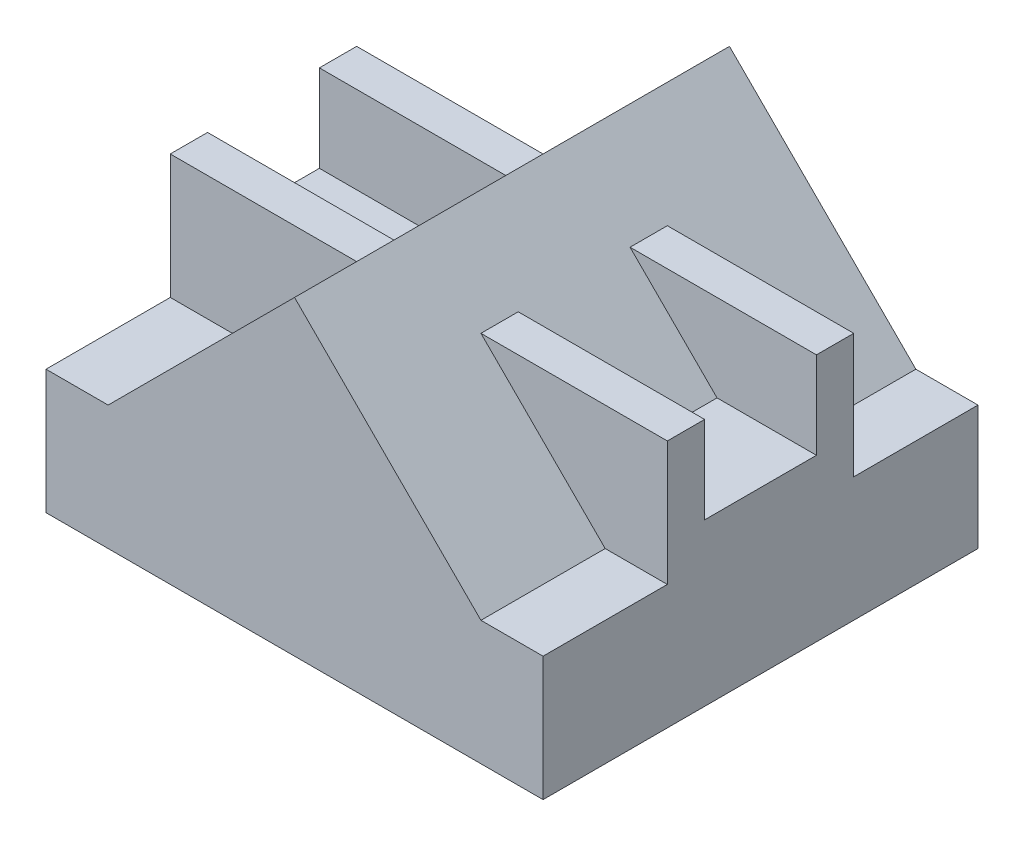
ISO-10303-21;
HEADER;
FILE_DESCRIPTION(('STEP AP214'),'2;1');
FILE_NAME('part.step','',(''),(''),'','','');
FILE_SCHEMA(('AUTOMOTIVE_DESIGN { 1 0 10303 214 1 1 1 1 }'));
ENDSEC;
DATA;
#1=APPLICATION_CONTEXT('core data for automotive mechanical design processes');
#2=APPLICATION_PROTOCOL_DEFINITION('international standard','automotive_design',2000,#1);
#3=PRODUCT_CONTEXT('',#1,'mechanical');
#4=PRODUCT('Part','Part','',(#3));
#5=PRODUCT_RELATED_PRODUCT_CATEGORY('part','',(#4));
#6=PRODUCT_DEFINITION_FORMATION('','',#4);
#7=PRODUCT_DEFINITION_CONTEXT('part definition',#1,'design');
#8=PRODUCT_DEFINITION('design','',#6,#7);
#9=PRODUCT_DEFINITION_SHAPE('','',#8);
#10=(LENGTH_UNIT() NAMED_UNIT(*) SI_UNIT(.MILLI.,.METRE.));
#11=(NAMED_UNIT(*) PLANE_ANGLE_UNIT() SI_UNIT($,.RADIAN.));
#12=(NAMED_UNIT(*) SI_UNIT($,.STERADIAN.) SOLID_ANGLE_UNIT());
#13=UNCERTAINTY_MEASURE_WITH_UNIT(LENGTH_MEASURE(1.E-05),#10,'distance_accuracy_value','');
#14=(GEOMETRIC_REPRESENTATION_CONTEXT(3) GLOBAL_UNCERTAINTY_ASSIGNED_CONTEXT((#13)) GLOBAL_UNIT_ASSIGNED_CONTEXT((#10,
#11,#12)) REPRESENTATION_CONTEXT('',''));
#15=CARTESIAN_POINT('',(0.,0.,0.));
#16=DIRECTION('',(0.,0.,1.));
#17=DIRECTION('',(1.,0.,0.));
#18=AXIS2_PLACEMENT_3D('',#15,#16,#17);
#19=CARTESIAN_POINT('',(0.,50.,-175.));
#20=DIRECTION('',(0.,1.,0.));
#21=DIRECTION('',(0.,0.,1.));
#22=AXIS2_PLACEMENT_3D('',#19,#20,#21);
#23=PLANE('',#22);
#24=DIRECTION('',(0.,0.,1.));
#25=VECTOR('',#24,1.);
#26=CARTESIAN_POINT('',(74.9999999999992,50.,-175.));
#27=LINE('',#26,#25);
#28=CARTESIAN_POINT('',(74.9999999999992,50.,-175.));
#29=VERTEX_POINT('',#28);
#30=CARTESIAN_POINT('',(74.9999999999992,50.,-125.));
#31=VERTEX_POINT('',#30);
#32=EDGE_CURVE('E339',#29,#31,#27,.T.);
#33=ORIENTED_EDGE('',*,*,#32,.T.);
#34=DIRECTION('',(1.,0.,0.));
#35=VECTOR('',#34,1.);
#36=CARTESIAN_POINT('',(-100.,50.,-125.));
#37=LINE('',#36,#35);
#38=CARTESIAN_POINT('',(100.,50.,-125.));
#39=VERTEX_POINT('',#38);
#40=EDGE_CURVE('E241',#31,#39,#37,.T.);
#41=ORIENTED_EDGE('',*,*,#40,.T.);
#42=DIRECTION('',(0.,0.,1.));
#43=VECTOR('',#42,1.);
#44=CARTESIAN_POINT('',(100.,50.,-175.));
#45=LINE('',#44,#43);
#46=CARTESIAN_POINT('',(100.,50.,-175.));
#47=VERTEX_POINT('',#46);
#48=EDGE_CURVE('E342',#47,#39,#45,.T.);
#49=ORIENTED_EDGE('',*,*,#48,.F.);
#50=DIRECTION('',(-1.,0.,0.));
#51=VECTOR('',#50,1.);
#52=CARTESIAN_POINT('',(0.,50.,-175.));
#53=LINE('',#52,#51);
#54=EDGE_CURVE('E318',#47,#29,#53,.T.);
#55=ORIENTED_EDGE('',*,*,#54,.T.);
#56=EDGE_LOOP('',(#33,#41,#49,#55));
#57=FACE_BOUND('',#56,.T.);
#58=ADVANCED_FACE('F41',(#57),#23,.T.);
#59=CARTESIAN_POINT('',(0.,49.9999999999999,-175.));
#60=DIRECTION('',(0.,-1.,0.));
#61=DIRECTION('',(1.,0.,0.));
#62=AXIS2_PLACEMENT_3D('',#59,#60,#61);
#63=PLANE('',#62);
#64=DIRECTION('',(1.,0.,0.));
#65=VECTOR('',#64,1.);
#66=CARTESIAN_POINT('',(-100.,50.,-50.));
#67=LINE('',#66,#65);
#68=CARTESIAN_POINT('',(-100.,50.,-50.));
#69=VERTEX_POINT('',#68);
#70=CARTESIAN_POINT('',(-74.9999999999992,50.,-50.));
#71=VERTEX_POINT('',#70);
#72=EDGE_CURVE('E62',#69,#71,#67,.T.);
#73=ORIENTED_EDGE('',*,*,#72,.F.);
#74=DIRECTION('',(0.,0.,1.));
#75=VECTOR('',#74,1.);
#76=CARTESIAN_POINT('',(-100.,50.,-175.));
#77=LINE('',#76,#75);
#78=CARTESIAN_POINT('',(-100.,50.,0.));
#79=VERTEX_POINT('',#78);
#80=EDGE_CURVE('E352',#69,#79,#77,.T.);
#81=ORIENTED_EDGE('',*,*,#80,.T.);
#82=DIRECTION('',(1.,0.,0.));
#83=VECTOR('',#82,1.);
#84=CARTESIAN_POINT('',(0.,49.9999999999999,0.));
#85=LINE('',#84,#83);
#86=CARTESIAN_POINT('',(-74.9999999999992,50.,0.));
#87=VERTEX_POINT('',#86);
#88=EDGE_CURVE('E330',#79,#87,#85,.T.);
#89=ORIENTED_EDGE('',*,*,#88,.T.);
#90=DIRECTION('',(0.,0.,1.));
#91=VECTOR('',#90,1.);
#92=CARTESIAN_POINT('',(-74.9999999999992,50.,-175.));
#93=LINE('',#92,#91);
#94=EDGE_CURVE('E358',#71,#87,#93,.T.);
#95=ORIENTED_EDGE('',*,*,#94,.F.);
#96=EDGE_LOOP('',(#73,#81,#89,#95));
#97=FACE_BOUND('',#96,.T.);
#98=ADVANCED_FACE('F414',(#97),#63,.F.);
#99=CARTESIAN_POINT('',(62.5,62.4999999999993,-175.));
#100=DIRECTION('',(-0.707106781186551,-0.707106781186544,0.));
#101=DIRECTION('',(0.707106781186544,-0.707106781186551,0.));
#102=AXIS2_PLACEMENT_3D('',#99,#100,#101);
#103=PLANE('',#102);
#104=CARTESIAN_POINT('',(74.9999999999991,50.,-50.));
#105=VERTEX_POINT('',#104);
#106=CARTESIAN_POINT('',(74.9999999999992,50.,0.));
#107=VERTEX_POINT('',#106);
#108=EDGE_CURVE('E341',#105,#107,#27,.T.);
#109=ORIENTED_EDGE('',*,*,#108,.F.);
#110=DIRECTION('',(-0.707106781186544,0.707106781186551,0.));
#111=VECTOR('',#110,1.);
#112=CARTESIAN_POINT('',(62.5,62.4999999999993,-50.));
#113=LINE('',#112,#111);
#114=CARTESIAN_POINT('',(24.9999999999997,100.,-50.));
#115=VERTEX_POINT('',#114);
#116=EDGE_CURVE('E297',#105,#115,#113,.T.);
#117=ORIENTED_EDGE('',*,*,#116,.T.);
#118=DIRECTION('',(0.,0.,-1.));
#119=VECTOR('',#118,1.);
#120=CARTESIAN_POINT('',(24.9999999999997,100.,-175.));
#121=LINE('',#120,#119);
#122=CARTESIAN_POINT('',(24.9999999999997,100.,-65.));
#123=VERTEX_POINT('',#122);
#124=EDGE_CURVE('E298',#115,#123,#121,.T.);
#125=ORIENTED_EDGE('',*,*,#124,.T.);
#126=DIRECTION('',(0.707106781186544,-0.707106781186551,0.));
#127=VECTOR('',#126,1.);
#128=CARTESIAN_POINT('',(62.5,62.4999999999993,-65.));
#129=LINE('',#128,#127);
#130=CARTESIAN_POINT('',(59.9999999999993,65.,-65.));
#131=VERTEX_POINT('',#130);
#132=EDGE_CURVE('E291',#123,#131,#129,.T.);
#133=ORIENTED_EDGE('',*,*,#132,.T.);
#134=DIRECTION('',(0.,0.,-1.));
#135=VECTOR('',#134,1.);
#136=CARTESIAN_POINT('',(59.9999999999993,65.,-175.));
#137=LINE('',#136,#135);
#138=CARTESIAN_POINT('',(59.9999999999993,65.,-110.));
#139=VERTEX_POINT('',#138);
#140=EDGE_CURVE('E289',#131,#139,#137,.T.);
#141=ORIENTED_EDGE('',*,*,#140,.T.);
#142=DIRECTION('',(-0.707106781186544,0.707106781186551,0.));
#143=VECTOR('',#142,1.);
#144=CARTESIAN_POINT('',(62.5,62.4999999999993,-110.));
#145=LINE('',#144,#143);
#146=CARTESIAN_POINT('',(24.9999999999997,100.,-110.));
#147=VERTEX_POINT('',#146);
#148=EDGE_CURVE('E290',#139,#147,#145,.T.);
#149=ORIENTED_EDGE('',*,*,#148,.T.);
#150=DIRECTION('',(0.,0.,-1.));
#151=VECTOR('',#150,1.);
#152=CARTESIAN_POINT('',(24.9999999999997,100.,-175.));
#153=LINE('',#152,#151);
#154=CARTESIAN_POINT('',(24.9999999999997,100.,-125.));
#155=VERTEX_POINT('',#154);
#156=EDGE_CURVE('E281',#147,#155,#153,.T.);
#157=ORIENTED_EDGE('',*,*,#156,.T.);
#158=DIRECTION('',(0.707106781186544,-0.707106781186551,0.));
#159=VECTOR('',#158,1.);
#160=CARTESIAN_POINT('',(62.5,62.4999999999993,-125.));
#161=LINE('',#160,#159);
#162=EDGE_CURVE('E263',#155,#31,#161,.T.);
#163=ORIENTED_EDGE('',*,*,#162,.T.);
#164=ORIENTED_EDGE('',*,*,#32,.F.);
#165=DIRECTION('',(0.707106781186544,-0.707106781186551,0.));
#166=VECTOR('',#165,1.);
#167=CARTESIAN_POINT('',(62.5,62.4999999999993,-175.));
#168=LINE('',#167,#166);
#169=CARTESIAN_POINT('',(0.,125.,-175.));
#170=VERTEX_POINT('',#169);
#171=EDGE_CURVE('E301',#170,#29,#168,.T.);
#172=ORIENTED_EDGE('',*,*,#171,.F.);
#173=DIRECTION('',(0.,0.,1.));
#174=VECTOR('',#173,1.);
#175=CARTESIAN_POINT('',(0.,125.,-175.));
#176=LINE('',#175,#174);
#177=CARTESIAN_POINT('',(0.,125.,0.));
#178=VERTEX_POINT('',#177);
#179=EDGE_CURVE('E321',#170,#178,#176,.T.);
#180=ORIENTED_EDGE('',*,*,#179,.T.);
#181=DIRECTION('',(0.707106781186544,-0.707106781186551,0.));
#182=VECTOR('',#181,1.);
#183=CARTESIAN_POINT('',(62.5,62.4999999999993,0.));
#184=LINE('',#183,#182);
#185=EDGE_CURVE('E302',#178,#107,#184,.T.);
#186=ORIENTED_EDGE('',*,*,#185,.T.);
#187=EDGE_LOOP('',(#109,#117,#125,#133,#141,#149,#157,#163,#164,#172,#180,#186));
#188=FACE_BOUND('',#187,.T.);
#189=ADVANCED_FACE('F43',(#188),#103,.F.);
#190=CARTESIAN_POINT('',(100.,50.,-50.));
#191=VERTEX_POINT('',#190);
#192=EDGE_CURVE('E265',#105,#191,#67,.T.);
#193=ORIENTED_EDGE('',*,*,#192,.F.);
#194=ORIENTED_EDGE('',*,*,#108,.T.);
#195=DIRECTION('',(-1.,0.,0.));
#196=VECTOR('',#195,1.);
#197=CARTESIAN_POINT('',(0.,50.,0.));
#198=LINE('',#197,#196);
#199=CARTESIAN_POINT('',(100.,50.,0.));
#200=VERTEX_POINT('',#199);
#201=EDGE_CURVE('E308',#200,#107,#198,.T.);
#202=ORIENTED_EDGE('',*,*,#201,.F.);
#203=EDGE_CURVE('E347',#191,#200,#45,.T.);
#204=ORIENTED_EDGE('',*,*,#203,.F.);
#205=EDGE_LOOP('',(#193,#194,#202,#204));
#206=FACE_BOUND('',#205,.T.);
#207=ADVANCED_FACE('F407',(#206),#23,.T.);
#208=CARTESIAN_POINT('',(100.,0.,-175.));
#209=DIRECTION('',(1.,0.,0.));
#210=DIRECTION('',(0.,0.,-1.));
#211=AXIS2_PLACEMENT_3D('',#208,#209,#210);
#212=PLANE('',#211);
#213=DIRECTION('',(0.,1.,0.));
#214=VECTOR('',#213,1.);
#215=CARTESIAN_POINT('',(100.,0.,0.));
#216=LINE('',#215,#214);
#217=CARTESIAN_POINT('',(100.,0.,0.));
#218=VERTEX_POINT('',#217);
#219=EDGE_CURVE('E332',#218,#200,#216,.T.);
#220=ORIENTED_EDGE('',*,*,#219,.F.);
#221=DIRECTION('',(0.,0.,1.));
#222=VECTOR('',#221,1.);
#223=CARTESIAN_POINT('',(100.,0.,-175.));
#224=LINE('',#223,#222);
#225=CARTESIAN_POINT('',(100.,0.,-175.));
#226=VERTEX_POINT('',#225);
#227=EDGE_CURVE('E346',#226,#218,#224,.T.);
#228=ORIENTED_EDGE('',*,*,#227,.F.);
#229=DIRECTION('',(0.,1.,0.));
#230=VECTOR('',#229,1.);
#231=CARTESIAN_POINT('',(100.,0.,-175.));
#232=LINE('',#231,#230);
#233=EDGE_CURVE('E314',#226,#47,#232,.T.);
#234=ORIENTED_EDGE('',*,*,#233,.T.);
#235=ORIENTED_EDGE('',*,*,#48,.T.);
#236=DIRECTION('',(0.,1.,0.));
#237=VECTOR('',#236,1.);
#238=CARTESIAN_POINT('',(100.,50.,-125.));
#239=LINE('',#238,#237);
#240=CARTESIAN_POINT('',(100.,100.,-125.));
#241=VERTEX_POINT('',#240);
#242=EDGE_CURVE('E242',#39,#241,#239,.T.);
#243=ORIENTED_EDGE('',*,*,#242,.T.);
#244=DIRECTION('',(0.,0.,1.));
#245=VECTOR('',#244,1.);
#246=CARTESIAN_POINT('',(100.,100.,-125.));
#247=LINE('',#246,#245);
#248=CARTESIAN_POINT('',(100.,100.,-110.));
#249=VERTEX_POINT('',#248);
#250=EDGE_CURVE('E250',#241,#249,#247,.T.);
#251=ORIENTED_EDGE('',*,*,#250,.T.);
#252=DIRECTION('',(0.,-1.,0.));
#253=VECTOR('',#252,1.);
#254=CARTESIAN_POINT('',(100.,100.,-110.));
#255=LINE('',#254,#253);
#256=CARTESIAN_POINT('',(100.,65.,-110.));
#257=VERTEX_POINT('',#256);
#258=EDGE_CURVE('E248',#249,#257,#255,.T.);
#259=ORIENTED_EDGE('',*,*,#258,.T.);
#260=DIRECTION('',(0.,0.,1.));
#261=VECTOR('',#260,1.);
#262=CARTESIAN_POINT('',(100.,65.,-65.));
#263=LINE('',#262,#261);
#264=CARTESIAN_POINT('',(100.,65.,-65.));
#265=VERTEX_POINT('',#264);
#266=EDGE_CURVE('E251',#257,#265,#263,.T.);
#267=ORIENTED_EDGE('',*,*,#266,.T.);
#268=DIRECTION('',(0.,1.,0.));
#269=VECTOR('',#268,1.);
#270=CARTESIAN_POINT('',(100.,100.,-65.));
#271=LINE('',#270,#269);
#272=CARTESIAN_POINT('',(100.,100.,-65.));
#273=VERTEX_POINT('',#272);
#274=EDGE_CURVE('E258',#265,#273,#271,.T.);
#275=ORIENTED_EDGE('',*,*,#274,.T.);
#276=DIRECTION('',(0.,0.,1.));
#277=VECTOR('',#276,1.);
#278=CARTESIAN_POINT('',(100.,100.,-50.));
#279=LINE('',#278,#277);
#280=CARTESIAN_POINT('',(100.,100.,-50.));
#281=VERTEX_POINT('',#280);
#282=EDGE_CURVE('E230',#273,#281,#279,.T.);
#283=ORIENTED_EDGE('',*,*,#282,.T.);
#284=DIRECTION('',(0.,-1.,0.));
#285=VECTOR('',#284,1.);
#286=CARTESIAN_POINT('',(100.,50.,-50.));
#287=LINE('',#286,#285);
#288=EDGE_CURVE('E57',#281,#191,#287,.T.);
#289=ORIENTED_EDGE('',*,*,#288,.T.);
#290=ORIENTED_EDGE('',*,*,#203,.T.);
#291=EDGE_LOOP('',(#220,#228,#234,#235,#243,#251,#259,#267,#275,#283,#289,#290));
#292=FACE_BOUND('',#291,.T.);
#293=ADVANCED_FACE('F404',(#292),#212,.T.);
#294=CARTESIAN_POINT('',(0.,0.,-175.));
#295=DIRECTION('',(0.,1.,0.));
#296=DIRECTION('',(0.,0.,1.));
#297=AXIS2_PLACEMENT_3D('',#294,#295,#296);
#298=PLANE('',#297);
#299=DIRECTION('',(-1.,0.,0.));
#300=VECTOR('',#299,1.);
#301=CARTESIAN_POINT('',(0.,0.,0.));
#302=LINE('',#301,#300);
#303=CARTESIAN_POINT('',(-100.,0.,0.));
#304=VERTEX_POINT('',#303);
#305=EDGE_CURVE('E335',#218,#304,#302,.T.);
#306=ORIENTED_EDGE('',*,*,#305,.T.);
#307=DIRECTION('',(0.,0.,1.));
#308=VECTOR('',#307,1.);
#309=CARTESIAN_POINT('',(-100.,0.,-175.));
#310=LINE('',#309,#308);
#311=CARTESIAN_POINT('',(-100.,0.,-175.));
#312=VERTEX_POINT('',#311);
#313=EDGE_CURVE('E349',#312,#304,#310,.T.);
#314=ORIENTED_EDGE('',*,*,#313,.F.);
#315=DIRECTION('',(-1.,0.,0.));
#316=VECTOR('',#315,1.);
#317=CARTESIAN_POINT('',(0.,0.,-175.));
#318=LINE('',#317,#316);
#319=EDGE_CURVE('E313',#226,#312,#318,.T.);
#320=ORIENTED_EDGE('',*,*,#319,.F.);
#321=ORIENTED_EDGE('',*,*,#227,.T.);
#322=EDGE_LOOP('',(#306,#314,#320,#321));
#323=FACE_BOUND('',#322,.T.);
#324=ADVANCED_FACE('F396',(#323),#298,.F.);
#325=CARTESIAN_POINT('',(-100.,0.,-175.));
#326=DIRECTION('',(1.,0.,0.));
#327=DIRECTION('',(0.,0.,-1.));
#328=AXIS2_PLACEMENT_3D('',#325,#326,#327);
#329=PLANE('',#328);
#330=DIRECTION('',(0.,1.,0.));
#331=VECTOR('',#330,1.);
#332=CARTESIAN_POINT('',(-100.,0.,0.));
#333=LINE('',#332,#331);
#334=EDGE_CURVE('E328',#304,#79,#333,.T.);
#335=ORIENTED_EDGE('',*,*,#334,.T.);
#336=ORIENTED_EDGE('',*,*,#80,.F.);
#337=DIRECTION('',(0.,-1.,0.));
#338=VECTOR('',#337,1.);
#339=CARTESIAN_POINT('',(-100.,50.,-50.));
#340=LINE('',#339,#338);
#341=CARTESIAN_POINT('',(-100.,100.,-50.));
#342=VERTEX_POINT('',#341);
#343=EDGE_CURVE('E238',#342,#69,#340,.T.);
#344=ORIENTED_EDGE('',*,*,#343,.F.);
#345=DIRECTION('',(0.,0.,1.));
#346=VECTOR('',#345,1.);
#347=CARTESIAN_POINT('',(-100.,100.,-50.));
#348=LINE('',#347,#346);
#349=CARTESIAN_POINT('',(-100.,100.,-65.));
#350=VERTEX_POINT('',#349);
#351=EDGE_CURVE('E240',#350,#342,#348,.T.);
#352=ORIENTED_EDGE('',*,*,#351,.F.);
#353=DIRECTION('',(0.,1.,0.));
#354=VECTOR('',#353,1.);
#355=CARTESIAN_POINT('',(-100.,100.,-65.));
#356=LINE('',#355,#354);
#357=CARTESIAN_POINT('',(-100.,65.,-65.));
#358=VERTEX_POINT('',#357);
#359=EDGE_CURVE('E233',#358,#350,#356,.T.);
#360=ORIENTED_EDGE('',*,*,#359,.F.);
#361=DIRECTION('',(0.,0.,1.));
#362=VECTOR('',#361,1.);
#363=CARTESIAN_POINT('',(-100.,65.,-65.));
#364=LINE('',#363,#362);
#365=CARTESIAN_POINT('',(-100.,65.,-110.));
#366=VERTEX_POINT('',#365);
#367=EDGE_CURVE('E231',#366,#358,#364,.T.);
#368=ORIENTED_EDGE('',*,*,#367,.F.);
#369=DIRECTION('',(0.,-1.,0.));
#370=VECTOR('',#369,1.);
#371=CARTESIAN_POINT('',(-100.,100.,-110.));
#372=LINE('',#371,#370);
#373=CARTESIAN_POINT('',(-100.,100.,-110.));
#374=VERTEX_POINT('',#373);
#375=EDGE_CURVE('E217',#374,#366,#372,.T.);
#376=ORIENTED_EDGE('',*,*,#375,.F.);
#377=DIRECTION('',(0.,0.,1.));
#378=VECTOR('',#377,1.);
#379=CARTESIAN_POINT('',(-100.,100.,-125.));
#380=LINE('',#379,#378);
#381=CARTESIAN_POINT('',(-100.,100.,-125.));
#382=VERTEX_POINT('',#381);
#383=EDGE_CURVE('E201',#382,#374,#380,.T.);
#384=ORIENTED_EDGE('',*,*,#383,.F.);
#385=DIRECTION('',(0.,1.,0.));
#386=VECTOR('',#385,1.);
#387=CARTESIAN_POINT('',(-100.,50.,-125.));
#388=LINE('',#387,#386);
#389=CARTESIAN_POINT('',(-100.,50.,-125.));
#390=VERTEX_POINT('',#389);
#391=EDGE_CURVE('E220',#390,#382,#388,.T.);
#392=ORIENTED_EDGE('',*,*,#391,.F.);
#393=CARTESIAN_POINT('',(-100.,50.,-175.));
#394=VERTEX_POINT('',#393);
#395=EDGE_CURVE('E351',#394,#390,#77,.T.);
#396=ORIENTED_EDGE('',*,*,#395,.F.);
#397=DIRECTION('',(0.,1.,0.));
#398=VECTOR('',#397,1.);
#399=CARTESIAN_POINT('',(-100.,0.,-175.));
#400=LINE('',#399,#398);
#401=EDGE_CURVE('E311',#312,#394,#400,.T.);
#402=ORIENTED_EDGE('',*,*,#401,.F.);
#403=ORIENTED_EDGE('',*,*,#313,.T.);
#404=EDGE_LOOP('',(#335,#336,#344,#352,#360,#368,#376,#384,#392,#396,#402,#403));
#405=FACE_BOUND('',#404,.T.);
#406=ADVANCED_FACE('F214',(#405),#329,.F.);
#407=ORIENTED_EDGE('',*,*,#395,.T.);
#408=CARTESIAN_POINT('',(-74.9999999999992,50.,-125.));
#409=VERTEX_POINT('',#408);
#410=EDGE_CURVE('E224',#390,#409,#37,.T.);
#411=ORIENTED_EDGE('',*,*,#410,.T.);
#412=CARTESIAN_POINT('',(-74.9999999999992,50.,-175.));
#413=VERTEX_POINT('',#412);
#414=EDGE_CURVE('E356',#413,#409,#93,.T.);
#415=ORIENTED_EDGE('',*,*,#414,.F.);
#416=DIRECTION('',(1.,0.,0.));
#417=VECTOR('',#416,1.);
#418=CARTESIAN_POINT('',(0.,49.9999999999999,-175.));
#419=LINE('',#418,#417);
#420=EDGE_CURVE('E309',#394,#413,#419,.T.);
#421=ORIENTED_EDGE('',*,*,#420,.F.);
#422=EDGE_LOOP('',(#407,#411,#415,#421));
#423=FACE_BOUND('',#422,.T.);
#424=ADVANCED_FACE('F386',(#423),#63,.F.);
#425=CARTESIAN_POINT('',(-62.5,62.4999999999993,-175.));
#426=DIRECTION('',(-0.707106781186551,0.707106781186544,0.));
#427=DIRECTION('',(-0.707106781186544,-0.707106781186551,0.));
#428=AXIS2_PLACEMENT_3D('',#425,#426,#427);
#429=PLANE('',#428);
#430=DIRECTION('',(0.707106781186544,0.707106781186551,0.));
#431=VECTOR('',#430,1.);
#432=CARTESIAN_POINT('',(-62.5,62.4999999999993,-50.));
#433=LINE('',#432,#431);
#434=CARTESIAN_POINT('',(-24.9999999999997,100.,-50.));
#435=VERTEX_POINT('',#434);
#436=EDGE_CURVE('E11',#71,#435,#433,.T.);
#437=ORIENTED_EDGE('',*,*,#436,.F.);
#438=ORIENTED_EDGE('',*,*,#94,.T.);
#439=DIRECTION('',(-0.707106781186544,-0.707106781186551,0.));
#440=VECTOR('',#439,1.);
#441=CARTESIAN_POINT('',(-62.5,62.4999999999993,0.));
#442=LINE('',#441,#440);
#443=EDGE_CURVE('E323',#178,#87,#442,.T.);
#444=ORIENTED_EDGE('',*,*,#443,.F.);
#445=ORIENTED_EDGE('',*,*,#179,.F.);
#446=DIRECTION('',(-0.707106781186544,-0.707106781186551,0.));
#447=VECTOR('',#446,1.);
#448=CARTESIAN_POINT('',(-62.5,62.4999999999993,-175.));
#449=LINE('',#448,#447);
#450=EDGE_CURVE('E304',#170,#413,#449,.T.);
#451=ORIENTED_EDGE('',*,*,#450,.T.);
#452=ORIENTED_EDGE('',*,*,#414,.T.);
#453=DIRECTION('',(-0.707106781186544,-0.707106781186551,0.));
#454=VECTOR('',#453,1.);
#455=CARTESIAN_POINT('',(-62.5,62.4999999999993,-125.));
#456=LINE('',#455,#454);
#457=CARTESIAN_POINT('',(-24.9999999999997,100.,-125.));
#458=VERTEX_POINT('',#457);
#459=EDGE_CURVE('E345',#458,#409,#456,.T.);
#460=ORIENTED_EDGE('',*,*,#459,.F.);
#461=DIRECTION('',(0.,0.,-1.));
#462=VECTOR('',#461,1.);
#463=CARTESIAN_POINT('',(-24.9999999999997,100.,-175.));
#464=LINE('',#463,#462);
#465=CARTESIAN_POINT('',(-24.9999999999997,100.,-110.));
#466=VERTEX_POINT('',#465);
#467=EDGE_CURVE('E204',#466,#458,#464,.T.);
#468=ORIENTED_EDGE('',*,*,#467,.F.);
#469=DIRECTION('',(0.707106781186544,0.707106781186551,0.));
#470=VECTOR('',#469,1.);
#471=CARTESIAN_POINT('',(-62.5,62.4999999999993,-110.));
#472=LINE('',#471,#470);
#473=CARTESIAN_POINT('',(-59.9999999999993,65.,-110.));
#474=VERTEX_POINT('',#473);
#475=EDGE_CURVE('E365',#474,#466,#472,.T.);
#476=ORIENTED_EDGE('',*,*,#475,.F.);
#477=DIRECTION('',(0.,0.,-1.));
#478=VECTOR('',#477,1.);
#479=CARTESIAN_POINT('',(-59.9999999999993,65.,-175.));
#480=LINE('',#479,#478);
#481=CARTESIAN_POINT('',(-59.9999999999993,65.,-65.));
#482=VERTEX_POINT('',#481);
#483=EDGE_CURVE('E364',#482,#474,#480,.T.);
#484=ORIENTED_EDGE('',*,*,#483,.F.);
#485=DIRECTION('',(-0.707106781186544,-0.707106781186551,0.));
#486=VECTOR('',#485,1.);
#487=CARTESIAN_POINT('',(-62.5,62.4999999999993,-65.));
#488=LINE('',#487,#486);
#489=CARTESIAN_POINT('',(-24.9999999999997,100.,-65.));
#490=VERTEX_POINT('',#489);
#491=EDGE_CURVE('E367',#490,#482,#488,.T.);
#492=ORIENTED_EDGE('',*,*,#491,.F.);
#493=DIRECTION('',(0.,0.,-1.));
#494=VECTOR('',#493,1.);
#495=CARTESIAN_POINT('',(-24.9999999999997,100.,-175.));
#496=LINE('',#495,#494);
#497=EDGE_CURVE('E47',#435,#490,#496,.T.);
#498=ORIENTED_EDGE('',*,*,#497,.F.);
#499=EDGE_LOOP('',(#437,#438,#444,#445,#451,#452,#460,#468,#476,#484,#492,#498));
#500=FACE_BOUND('',#499,.T.);
#501=ADVANCED_FACE('F381',(#500),#429,.T.);
#502=CARTESIAN_POINT('',(0.,0.,-175.));
#503=DIRECTION('',(0.,0.,1.));
#504=DIRECTION('',(1.,0.,0.));
#505=AXIS2_PLACEMENT_3D('',#502,#503,#504);
#506=PLANE('',#505);
#507=ORIENTED_EDGE('',*,*,#420,.T.);
#508=ORIENTED_EDGE('',*,*,#450,.F.);
#509=ORIENTED_EDGE('',*,*,#171,.T.);
#510=ORIENTED_EDGE('',*,*,#54,.F.);
#511=ORIENTED_EDGE('',*,*,#233,.F.);
#512=ORIENTED_EDGE('',*,*,#319,.T.);
#513=ORIENTED_EDGE('',*,*,#401,.T.);
#514=EDGE_LOOP('',(#507,#508,#509,#510,#511,#512,#513));
#515=FACE_BOUND('',#514,.T.);
#516=ADVANCED_FACE('F391',(#515),#506,.F.);
#517=CARTESIAN_POINT('',(0.,0.,0.));
#518=DIRECTION('',(0.,0.,1.));
#519=DIRECTION('',(1.,0.,0.));
#520=AXIS2_PLACEMENT_3D('',#517,#518,#519);
#521=PLANE('',#520);
#522=ORIENTED_EDGE('',*,*,#201,.T.);
#523=ORIENTED_EDGE('',*,*,#185,.F.);
#524=ORIENTED_EDGE('',*,*,#443,.T.);
#525=ORIENTED_EDGE('',*,*,#88,.F.);
#526=ORIENTED_EDGE('',*,*,#334,.F.);
#527=ORIENTED_EDGE('',*,*,#305,.F.);
#528=ORIENTED_EDGE('',*,*,#219,.T.);
#529=EDGE_LOOP('',(#522,#523,#524,#525,#526,#527,#528));
#530=FACE_BOUND('',#529,.T.);
#531=ADVANCED_FACE('F405',(#530),#521,.T.);
#532=CARTESIAN_POINT('',(-100.,50.,-125.));
#533=DIRECTION('',(0.,0.,-1.));
#534=DIRECTION('',(-1.,0.,0.));
#535=AXIS2_PLACEMENT_3D('',#532,#533,#534);
#536=PLANE('',#535);
#537=DIRECTION('',(1.,0.,0.));
#538=VECTOR('',#537,1.);
#539=CARTESIAN_POINT('',(-100.,100.,-125.));
#540=LINE('',#539,#538);
#541=EDGE_CURVE('E197',#382,#458,#540,.T.);
#542=ORIENTED_EDGE('',*,*,#541,.T.);
#543=ORIENTED_EDGE('',*,*,#459,.T.);
#544=ORIENTED_EDGE('',*,*,#410,.F.);
#545=ORIENTED_EDGE('',*,*,#391,.T.);
#546=EDGE_LOOP('',(#542,#543,#544,#545));
#547=FACE_BOUND('',#546,.T.);
#548=ADVANCED_FACE('F223',(#547),#536,.T.);
#549=CARTESIAN_POINT('',(-100.,100.,-125.));
#550=DIRECTION('',(0.,1.,0.));
#551=DIRECTION('',(0.,0.,1.));
#552=AXIS2_PLACEMENT_3D('',#549,#550,#551);
#553=PLANE('',#552);
#554=DIRECTION('',(1.,0.,0.));
#555=VECTOR('',#554,1.);
#556=CARTESIAN_POINT('',(-100.,100.,-110.));
#557=LINE('',#556,#555);
#558=EDGE_CURVE('E278',#374,#466,#557,.T.);
#559=ORIENTED_EDGE('',*,*,#558,.T.);
#560=ORIENTED_EDGE('',*,*,#467,.T.);
#561=ORIENTED_EDGE('',*,*,#541,.F.);
#562=ORIENTED_EDGE('',*,*,#383,.T.);
#563=EDGE_LOOP('',(#559,#560,#561,#562));
#564=FACE_BOUND('',#563,.T.);
#565=ADVANCED_FACE('F205',(#564),#553,.T.);
#566=CARTESIAN_POINT('',(-100.,100.,-110.));
#567=DIRECTION('',(0.,0.,1.));
#568=DIRECTION('',(1.,0.,0.));
#569=AXIS2_PLACEMENT_3D('',#566,#567,#568);
#570=PLANE('',#569);
#571=DIRECTION('',(1.,0.,0.));
#572=VECTOR('',#571,1.);
#573=CARTESIAN_POINT('',(-100.,65.,-110.));
#574=LINE('',#573,#572);
#575=EDGE_CURVE('E274',#366,#474,#574,.T.);
#576=ORIENTED_EDGE('',*,*,#575,.T.);
#577=ORIENTED_EDGE('',*,*,#475,.T.);
#578=ORIENTED_EDGE('',*,*,#558,.F.);
#579=ORIENTED_EDGE('',*,*,#375,.T.);
#580=EDGE_LOOP('',(#576,#577,#578,#579));
#581=FACE_BOUND('',#580,.T.);
#582=ADVANCED_FACE('F385',(#581),#570,.T.);
#583=CARTESIAN_POINT('',(-100.,65.,-65.));
#584=DIRECTION('',(0.,1.,0.));
#585=DIRECTION('',(0.,0.,1.));
#586=AXIS2_PLACEMENT_3D('',#583,#584,#585);
#587=PLANE('',#586);
#588=DIRECTION('',(1.,0.,0.));
#589=VECTOR('',#588,1.);
#590=CARTESIAN_POINT('',(-100.,65.,-65.));
#591=LINE('',#590,#589);
#592=EDGE_CURVE('E271',#358,#482,#591,.T.);
#593=ORIENTED_EDGE('',*,*,#592,.T.);
#594=ORIENTED_EDGE('',*,*,#483,.T.);
#595=ORIENTED_EDGE('',*,*,#575,.F.);
#596=ORIENTED_EDGE('',*,*,#367,.T.);
#597=EDGE_LOOP('',(#593,#594,#595,#596));
#598=FACE_BOUND('',#597,.T.);
#599=ADVANCED_FACE('F379',(#598),#587,.T.);
#600=CARTESIAN_POINT('',(-100.,100.,-65.));
#601=DIRECTION('',(0.,0.,-1.));
#602=DIRECTION('',(-1.,0.,0.));
#603=AXIS2_PLACEMENT_3D('',#600,#601,#602);
#604=PLANE('',#603);
#605=DIRECTION('',(1.,0.,0.));
#606=VECTOR('',#605,1.);
#607=CARTESIAN_POINT('',(-100.,100.,-65.));
#608=LINE('',#607,#606);
#609=EDGE_CURVE('E270',#350,#490,#608,.T.);
#610=ORIENTED_EDGE('',*,*,#609,.T.);
#611=ORIENTED_EDGE('',*,*,#491,.T.);
#612=ORIENTED_EDGE('',*,*,#592,.F.);
#613=ORIENTED_EDGE('',*,*,#359,.T.);
#614=EDGE_LOOP('',(#610,#611,#612,#613));
#615=FACE_BOUND('',#614,.T.);
#616=ADVANCED_FACE('F378',(#615),#604,.T.);
#617=CARTESIAN_POINT('',(-100.,100.,-50.));
#618=DIRECTION('',(0.,1.,0.));
#619=DIRECTION('',(0.,0.,1.));
#620=AXIS2_PLACEMENT_3D('',#617,#618,#619);
#621=PLANE('',#620);
#622=DIRECTION('',(1.,0.,0.));
#623=VECTOR('',#622,1.);
#624=CARTESIAN_POINT('',(-100.,100.,-50.));
#625=LINE('',#624,#623);
#626=EDGE_CURVE('E261',#342,#435,#625,.T.);
#627=ORIENTED_EDGE('',*,*,#626,.T.);
#628=ORIENTED_EDGE('',*,*,#497,.T.);
#629=ORIENTED_EDGE('',*,*,#609,.F.);
#630=ORIENTED_EDGE('',*,*,#351,.T.);
#631=EDGE_LOOP('',(#627,#628,#629,#630));
#632=FACE_BOUND('',#631,.T.);
#633=ADVANCED_FACE('F375',(#632),#621,.T.);
#634=CARTESIAN_POINT('',(-100.,50.,-50.));
#635=DIRECTION('',(0.,0.,1.));
#636=DIRECTION('',(1.,0.,0.));
#637=AXIS2_PLACEMENT_3D('',#634,#635,#636);
#638=PLANE('',#637);
#639=ORIENTED_EDGE('',*,*,#72,.T.);
#640=ORIENTED_EDGE('',*,*,#436,.T.);
#641=ORIENTED_EDGE('',*,*,#626,.F.);
#642=ORIENTED_EDGE('',*,*,#343,.T.);
#643=EDGE_LOOP('',(#639,#640,#641,#642));
#644=FACE_BOUND('',#643,.T.);
#645=ADVANCED_FACE('F420',(#644),#638,.T.);
#646=ORIENTED_EDGE('',*,*,#116,.F.);
#647=ORIENTED_EDGE('',*,*,#192,.T.);
#648=ORIENTED_EDGE('',*,*,#288,.F.);
#649=EDGE_CURVE('E266',#115,#281,#625,.T.);
#650=ORIENTED_EDGE('',*,*,#649,.F.);
#651=EDGE_LOOP('',(#646,#647,#648,#650));
#652=FACE_BOUND('',#651,.T.);
#653=ADVANCED_FACE('F416',(#652),#638,.T.);
#654=ORIENTED_EDGE('',*,*,#124,.F.);
#655=ORIENTED_EDGE('',*,*,#649,.T.);
#656=ORIENTED_EDGE('',*,*,#282,.F.);
#657=EDGE_CURVE('E269',#123,#273,#608,.T.);
#658=ORIENTED_EDGE('',*,*,#657,.F.);
#659=EDGE_LOOP('',(#654,#655,#656,#658));
#660=FACE_BOUND('',#659,.T.);
#661=ADVANCED_FACE('F424',(#660),#621,.T.);
#662=ORIENTED_EDGE('',*,*,#132,.F.);
#663=ORIENTED_EDGE('',*,*,#657,.T.);
#664=ORIENTED_EDGE('',*,*,#274,.F.);
#665=EDGE_CURVE('E272',#131,#265,#591,.T.);
#666=ORIENTED_EDGE('',*,*,#665,.F.);
#667=EDGE_LOOP('',(#662,#663,#664,#666));
#668=FACE_BOUND('',#667,.T.);
#669=ADVANCED_FACE('F453',(#668),#604,.T.);
#670=ORIENTED_EDGE('',*,*,#140,.F.);
#671=ORIENTED_EDGE('',*,*,#665,.T.);
#672=ORIENTED_EDGE('',*,*,#266,.F.);
#673=EDGE_CURVE('E277',#139,#257,#574,.T.);
#674=ORIENTED_EDGE('',*,*,#673,.F.);
#675=EDGE_LOOP('',(#670,#671,#672,#674));
#676=FACE_BOUND('',#675,.T.);
#677=ADVANCED_FACE('F456',(#676),#587,.T.);
#678=ORIENTED_EDGE('',*,*,#148,.F.);
#679=ORIENTED_EDGE('',*,*,#673,.T.);
#680=ORIENTED_EDGE('',*,*,#258,.F.);
#681=EDGE_CURVE('E206',#147,#249,#557,.T.);
#682=ORIENTED_EDGE('',*,*,#681,.F.);
#683=EDGE_LOOP('',(#678,#679,#680,#682));
#684=FACE_BOUND('',#683,.T.);
#685=ADVANCED_FACE('F458',(#684),#570,.T.);
#686=ORIENTED_EDGE('',*,*,#156,.F.);
#687=ORIENTED_EDGE('',*,*,#681,.T.);
#688=ORIENTED_EDGE('',*,*,#250,.F.);
#689=EDGE_CURVE('E207',#155,#241,#540,.T.);
#690=ORIENTED_EDGE('',*,*,#689,.F.);
#691=EDGE_LOOP('',(#686,#687,#688,#690));
#692=FACE_BOUND('',#691,.T.);
#693=ADVANCED_FACE('F464',(#692),#553,.T.);
#694=ORIENTED_EDGE('',*,*,#162,.F.);
#695=ORIENTED_EDGE('',*,*,#689,.T.);
#696=ORIENTED_EDGE('',*,*,#242,.F.);
#697=ORIENTED_EDGE('',*,*,#40,.F.);
#698=EDGE_LOOP('',(#694,#695,#696,#697));
#699=FACE_BOUND('',#698,.T.);
#700=ADVANCED_FACE('F466',(#699),#536,.T.);
#701=CLOSED_SHELL('',(#58,#98,#189,#207,#293,#324,#406,#424,#501,#516,#531,#548,#565,#582,#599,
#616,#633,#645,#653,#661,#669,#677,#685,#693,#700));
#702=MANIFOLD_SOLID_BREP('B2',#701);
#703=ADVANCED_BREP_SHAPE_REPRESENTATION('',(#18,#702),#14);
#704=SHAPE_DEFINITION_REPRESENTATION(#9,#703);
ENDSEC;
END-ISO-10303-21;
